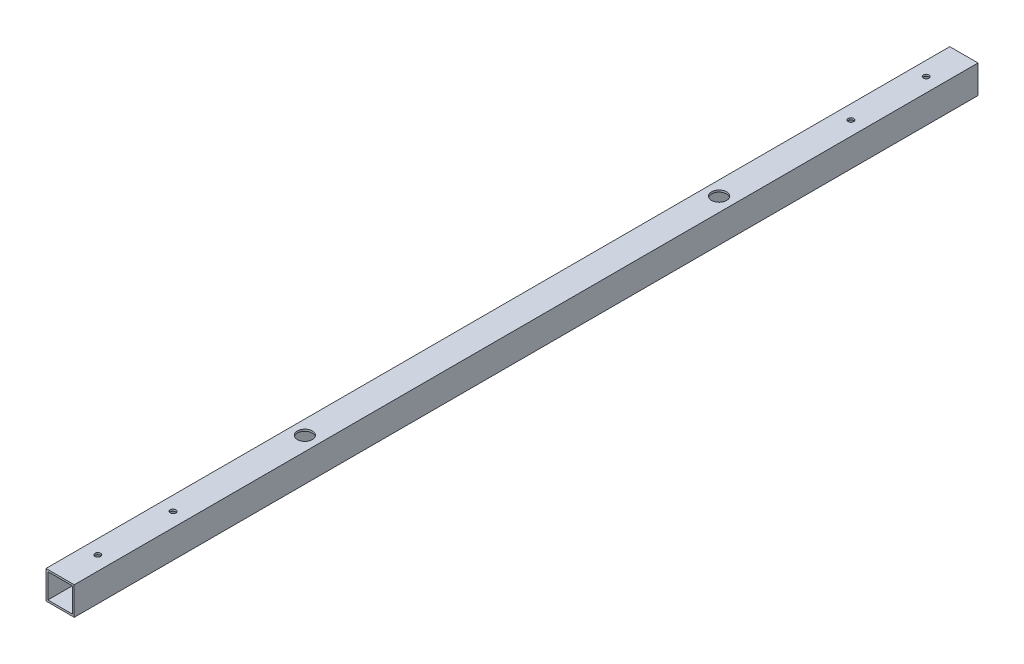
ISO-10303-21;
HEADER;
FILE_DESCRIPTION(('STEP AP214'),'2;1');
FILE_NAME('part.step','',(''),(''),'','','');
FILE_SCHEMA(('AUTOMOTIVE_DESIGN { 1 0 10303 214 1 1 1 1 }'));
ENDSEC;
DATA;
#1=APPLICATION_CONTEXT('core data for automotive mechanical design processes');
#2=APPLICATION_PROTOCOL_DEFINITION('international standard','automotive_design',2000,#1);
#3=PRODUCT_CONTEXT('',#1,'mechanical');
#4=PRODUCT('Part','Part','',(#3));
#5=PRODUCT_RELATED_PRODUCT_CATEGORY('part','',(#4));
#6=PRODUCT_DEFINITION_FORMATION('','',#4);
#7=PRODUCT_DEFINITION_CONTEXT('part definition',#1,'design');
#8=PRODUCT_DEFINITION('design','',#6,#7);
#9=PRODUCT_DEFINITION_SHAPE('','',#8);
#10=(LENGTH_UNIT() NAMED_UNIT(*) SI_UNIT(.MILLI.,.METRE.));
#11=(NAMED_UNIT(*) PLANE_ANGLE_UNIT() SI_UNIT($,.RADIAN.));
#12=(NAMED_UNIT(*) SI_UNIT($,.STERADIAN.) SOLID_ANGLE_UNIT());
#13=UNCERTAINTY_MEASURE_WITH_UNIT(LENGTH_MEASURE(1.E-05),#10,'distance_accuracy_value','');
#14=(GEOMETRIC_REPRESENTATION_CONTEXT(3) GLOBAL_UNCERTAINTY_ASSIGNED_CONTEXT((#13)) GLOBAL_UNIT_ASSIGNED_CONTEXT((#10,
#11,#12)) REPRESENTATION_CONTEXT('',''));
#15=CARTESIAN_POINT('',(0.,0.,0.));
#16=DIRECTION('',(0.,0.,1.));
#17=DIRECTION('',(1.,0.,0.));
#18=AXIS2_PLACEMENT_3D('',#15,#16,#17);
#19=CARTESIAN_POINT('',(7.5,-7.5,460.));
#20=DIRECTION('',(-1.,0.,0.));
#21=DIRECTION('',(0.,0.,1.));
#22=AXIS2_PLACEMENT_3D('',#19,#20,#21);
#23=PLANE('',#22);
#24=DIRECTION('',(0.,0.,-1.));
#25=VECTOR('',#24,1.);
#26=CARTESIAN_POINT('',(7.5,-7.5,460.));
#27=LINE('',#26,#25);
#28=CARTESIAN_POINT('',(7.5,-7.5,470.));
#29=VERTEX_POINT('',#28);
#30=CARTESIAN_POINT('',(7.5,-7.5,-10.));
#31=VERTEX_POINT('',#30);
#32=EDGE_CURVE('E104',#29,#31,#27,.T.);
#33=ORIENTED_EDGE('',*,*,#32,.T.);
#34=DIRECTION('',(0.,-1.,0.));
#35=VECTOR('',#34,1.);
#36=CARTESIAN_POINT('',(7.5,7.5,-10.));
#37=LINE('',#36,#35);
#38=CARTESIAN_POINT('',(7.5,7.5,-10.));
#39=VERTEX_POINT('',#38);
#40=EDGE_CURVE('E148',#39,#31,#37,.T.);
#41=ORIENTED_EDGE('',*,*,#40,.F.);
#42=DIRECTION('',(0.,0.,-1.));
#43=VECTOR('',#42,1.);
#44=CARTESIAN_POINT('',(7.5,7.5,460.));
#45=LINE('',#44,#43);
#46=CARTESIAN_POINT('',(7.5,7.5,470.));
#47=VERTEX_POINT('',#46);
#48=EDGE_CURVE('E11',#47,#39,#45,.T.);
#49=ORIENTED_EDGE('',*,*,#48,.F.);
#50=DIRECTION('',(0.,1.,0.));
#51=VECTOR('',#50,1.);
#52=CARTESIAN_POINT('',(7.5,-7.5,470.));
#53=LINE('',#52,#51);
#54=EDGE_CURVE('E136',#29,#47,#53,.T.);
#55=ORIENTED_EDGE('',*,*,#54,.F.);
#56=EDGE_LOOP('',(#33,#41,#49,#55));
#57=FACE_BOUND('',#56,.T.);
#58=ADVANCED_FACE('F34',(#57),#23,.F.);
#59=CARTESIAN_POINT('',(-7.5,7.5,460.));
#60=DIRECTION('',(0.,-1.,0.));
#61=DIRECTION('',(0.,0.,-1.));
#62=AXIS2_PLACEMENT_3D('',#59,#60,#61);
#63=PLANE('',#62);
#64=CARTESIAN_POINT('',(0.,7.5,50.));
#65=DIRECTION('',(0.,-1.,0.));
#66=DIRECTION('',(0.,0.,-1.));
#67=AXIS2_PLACEMENT_3D('',#64,#65,#66);
#68=CIRCLE('',#67,1.5);
#69=CARTESIAN_POINT('',(0.,7.5,48.5));
#70=VERTEX_POINT('',#69);
#71=EDGE_CURVE('E197',#70,#70,#68,.T.);
#72=ORIENTED_EDGE('',*,*,#71,.T.);
#73=EDGE_LOOP('',(#72));
#74=FACE_BOUND('',#73,.T.);
#75=CARTESIAN_POINT('',(0.,7.5,450.));
#76=DIRECTION('',(0.,-1.,0.));
#77=DIRECTION('',(0.,0.,1.));
#78=AXIS2_PLACEMENT_3D('',#75,#76,#77);
#79=CIRCLE('',#78,1.5);
#80=CARTESIAN_POINT('',(0.,7.5,451.5));
#81=VERTEX_POINT('',#80);
#82=EDGE_CURVE('E327',#81,#81,#79,.T.);
#83=ORIENTED_EDGE('',*,*,#82,.T.);
#84=EDGE_LOOP('',(#83));
#85=FACE_BOUND('',#84,.T.);
#86=CARTESIAN_POINT('',(0.,7.5,410.));
#87=DIRECTION('',(0.,-1.,0.));
#88=DIRECTION('',(0.,0.,1.));
#89=AXIS2_PLACEMENT_3D('',#86,#87,#88);
#90=CIRCLE('',#89,1.5);
#91=CARTESIAN_POINT('',(0.,7.5,411.5));
#92=VERTEX_POINT('',#91);
#93=EDGE_CURVE('E335',#92,#92,#90,.T.);
#94=ORIENTED_EDGE('',*,*,#93,.T.);
#95=EDGE_LOOP('',(#94));
#96=FACE_BOUND('',#95,.T.);
#97=CARTESIAN_POINT('',(0.,7.5,10.));
#98=DIRECTION('',(0.,-1.,0.));
#99=DIRECTION('',(0.,0.,-1.));
#100=AXIS2_PLACEMENT_3D('',#97,#98,#99);
#101=CIRCLE('',#100,1.5);
#102=CARTESIAN_POINT('',(0.,7.5,8.5));
#103=VERTEX_POINT('',#102);
#104=EDGE_CURVE('E193',#103,#103,#101,.T.);
#105=ORIENTED_EDGE('',*,*,#104,.T.);
#106=EDGE_LOOP('',(#105));
#107=FACE_BOUND('',#106,.T.);
#108=CARTESIAN_POINT('',(0.,7.5,340.));
#109=DIRECTION('',(0.,1.,0.));
#110=DIRECTION('',(0.,0.,1.));
#111=AXIS2_PLACEMENT_3D('',#108,#109,#110);
#112=CIRCLE('',#111,4.);
#113=CARTESIAN_POINT('',(0.,7.5,344.));
#114=VERTEX_POINT('',#113);
#115=EDGE_CURVE('E157',#114,#114,#112,.T.);
#116=ORIENTED_EDGE('',*,*,#115,.F.);
#117=EDGE_LOOP('',(#116));
#118=FACE_BOUND('',#117,.T.);
#119=CARTESIAN_POINT('',(0.,7.5,120.));
#120=DIRECTION('',(0.,1.,0.));
#121=DIRECTION('',(0.,0.,1.));
#122=AXIS2_PLACEMENT_3D('',#119,#120,#121);
#123=CIRCLE('',#122,4.);
#124=CARTESIAN_POINT('',(0.,7.5,124.));
#125=VERTEX_POINT('',#124);
#126=EDGE_CURVE('E161',#125,#125,#123,.T.);
#127=ORIENTED_EDGE('',*,*,#126,.F.);
#128=EDGE_LOOP('',(#127));
#129=FACE_BOUND('',#128,.T.);
#130=ORIENTED_EDGE('',*,*,#48,.T.);
#131=DIRECTION('',(1.,0.,0.));
#132=VECTOR('',#131,1.);
#133=CARTESIAN_POINT('',(-7.5,7.5,-10.));
#134=LINE('',#133,#132);
#135=CARTESIAN_POINT('',(-7.5,7.5,-10.));
#136=VERTEX_POINT('',#135);
#137=EDGE_CURVE('E145',#136,#39,#134,.T.);
#138=ORIENTED_EDGE('',*,*,#137,.F.);
#139=DIRECTION('',(0.,0.,-1.));
#140=VECTOR('',#139,1.);
#141=CARTESIAN_POINT('',(-7.5,7.5,460.));
#142=LINE('',#141,#140);
#143=CARTESIAN_POINT('',(-7.5,7.5,470.));
#144=VERTEX_POINT('',#143);
#145=EDGE_CURVE('E42',#144,#136,#142,.T.);
#146=ORIENTED_EDGE('',*,*,#145,.F.);
#147=DIRECTION('',(-1.,0.,0.));
#148=VECTOR('',#147,1.);
#149=CARTESIAN_POINT('',(7.5,7.5,470.));
#150=LINE('',#149,#148);
#151=EDGE_CURVE('E139',#47,#144,#150,.T.);
#152=ORIENTED_EDGE('',*,*,#151,.F.);
#153=EDGE_LOOP('',(#130,#138,#146,#152));
#154=FACE_BOUND('',#153,.T.);
#155=ADVANCED_FACE('F242',(#74,#85,#96,#107,#118,#129,#154),#63,.F.);
#156=CARTESIAN_POINT('',(-7.5,-7.5,460.));
#157=DIRECTION('',(1.,0.,0.));
#158=DIRECTION('',(0.,0.,-1.));
#159=AXIS2_PLACEMENT_3D('',#156,#157,#158);
#160=PLANE('',#159);
#161=ORIENTED_EDGE('',*,*,#145,.T.);
#162=DIRECTION('',(0.,1.,0.));
#163=VECTOR('',#162,1.);
#164=CARTESIAN_POINT('',(-7.5,-7.5,-10.));
#165=LINE('',#164,#163);
#166=CARTESIAN_POINT('',(-7.5,-7.5,-10.));
#167=VERTEX_POINT('',#166);
#168=EDGE_CURVE('E154',#167,#136,#165,.T.);
#169=ORIENTED_EDGE('',*,*,#168,.F.);
#170=DIRECTION('',(0.,0.,-1.));
#171=VECTOR('',#170,1.);
#172=CARTESIAN_POINT('',(-7.5,-7.5,460.));
#173=LINE('',#172,#171);
#174=CARTESIAN_POINT('',(-7.5,-7.5,470.));
#175=VERTEX_POINT('',#174);
#176=EDGE_CURVE('E183',#175,#167,#173,.T.);
#177=ORIENTED_EDGE('',*,*,#176,.F.);
#178=DIRECTION('',(0.,-1.,0.));
#179=VECTOR('',#178,1.);
#180=CARTESIAN_POINT('',(-7.5,7.5,470.));
#181=LINE('',#180,#179);
#182=EDGE_CURVE('E142',#144,#175,#181,.T.);
#183=ORIENTED_EDGE('',*,*,#182,.F.);
#184=EDGE_LOOP('',(#161,#169,#177,#183));
#185=FACE_BOUND('',#184,.T.);
#186=ADVANCED_FACE('F226',(#185),#160,.F.);
#187=CARTESIAN_POINT('',(-7.5,-7.5,460.));
#188=DIRECTION('',(0.,1.,0.));
#189=DIRECTION('',(0.,0.,1.));
#190=AXIS2_PLACEMENT_3D('',#187,#188,#189);
#191=PLANE('',#190);
#192=CARTESIAN_POINT('',(0.,-7.5,50.));
#193=DIRECTION('',(0.,-1.,0.));
#194=DIRECTION('',(0.,0.,-1.));
#195=AXIS2_PLACEMENT_3D('',#192,#193,#194);
#196=CIRCLE('',#195,1.5);
#197=CARTESIAN_POINT('',(0.,-7.5,48.5));
#198=VERTEX_POINT('',#197);
#199=EDGE_CURVE('E326',#198,#198,#196,.T.);
#200=ORIENTED_EDGE('',*,*,#199,.F.);
#201=EDGE_LOOP('',(#200));
#202=FACE_BOUND('',#201,.T.);
#203=CARTESIAN_POINT('',(0.,-7.5,450.));
#204=DIRECTION('',(0.,-1.,0.));
#205=DIRECTION('',(0.,0.,1.));
#206=AXIS2_PLACEMENT_3D('',#203,#204,#205);
#207=CIRCLE('',#206,1.5);
#208=CARTESIAN_POINT('',(0.,-7.5,451.5));
#209=VERTEX_POINT('',#208);
#210=EDGE_CURVE('E331',#209,#209,#207,.T.);
#211=ORIENTED_EDGE('',*,*,#210,.F.);
#212=EDGE_LOOP('',(#211));
#213=FACE_BOUND('',#212,.T.);
#214=CARTESIAN_POINT('',(0.,-7.5,410.));
#215=DIRECTION('',(0.,-1.,0.));
#216=DIRECTION('',(0.,0.,1.));
#217=AXIS2_PLACEMENT_3D('',#214,#215,#216);
#218=CIRCLE('',#217,1.5);
#219=CARTESIAN_POINT('',(0.,-7.5,411.5));
#220=VERTEX_POINT('',#219);
#221=EDGE_CURVE('E210',#220,#220,#218,.T.);
#222=ORIENTED_EDGE('',*,*,#221,.F.);
#223=EDGE_LOOP('',(#222));
#224=FACE_BOUND('',#223,.T.);
#225=CARTESIAN_POINT('',(0.,-7.5,10.));
#226=DIRECTION('',(0.,-1.,0.));
#227=DIRECTION('',(0.,0.,-1.));
#228=AXIS2_PLACEMENT_3D('',#225,#226,#227);
#229=CIRCLE('',#228,1.5);
#230=CARTESIAN_POINT('',(0.,-7.5,8.5));
#231=VERTEX_POINT('',#230);
#232=EDGE_CURVE('E216',#231,#231,#229,.T.);
#233=ORIENTED_EDGE('',*,*,#232,.F.);
#234=EDGE_LOOP('',(#233));
#235=FACE_BOUND('',#234,.T.);
#236=CARTESIAN_POINT('',(0.,-7.50000000000001,340.));
#237=DIRECTION('',(0.,1.,0.));
#238=DIRECTION('',(0.,0.,1.));
#239=AXIS2_PLACEMENT_3D('',#236,#237,#238);
#240=CIRCLE('',#239,1.5);
#241=CARTESIAN_POINT('',(0.,-7.50000000000001,341.5));
#242=VERTEX_POINT('',#241);
#243=EDGE_CURVE('E168',#242,#242,#240,.T.);
#244=ORIENTED_EDGE('',*,*,#243,.T.);
#245=EDGE_LOOP('',(#244));
#246=FACE_BOUND('',#245,.T.);
#247=CARTESIAN_POINT('',(0.,-7.50000000000001,120.));
#248=DIRECTION('',(0.,1.,0.));
#249=DIRECTION('',(0.,0.,1.));
#250=AXIS2_PLACEMENT_3D('',#247,#248,#249);
#251=CIRCLE('',#250,1.5);
#252=CARTESIAN_POINT('',(0.,-7.50000000000001,121.5));
#253=VERTEX_POINT('',#252);
#254=EDGE_CURVE('E174',#253,#253,#251,.T.);
#255=ORIENTED_EDGE('',*,*,#254,.T.);
#256=EDGE_LOOP('',(#255));
#257=FACE_BOUND('',#256,.T.);
#258=ORIENTED_EDGE('',*,*,#176,.T.);
#259=DIRECTION('',(-1.,0.,0.));
#260=VECTOR('',#259,1.);
#261=CARTESIAN_POINT('',(7.5,-7.5,-10.));
#262=LINE('',#261,#260);
#263=EDGE_CURVE('E151',#31,#167,#262,.T.);
#264=ORIENTED_EDGE('',*,*,#263,.F.);
#265=ORIENTED_EDGE('',*,*,#32,.F.);
#266=DIRECTION('',(1.,0.,0.));
#267=VECTOR('',#266,1.);
#268=CARTESIAN_POINT('',(-7.5,-7.5,470.));
#269=LINE('',#268,#267);
#270=EDGE_CURVE('E128',#175,#29,#269,.T.);
#271=ORIENTED_EDGE('',*,*,#270,.F.);
#272=EDGE_LOOP('',(#258,#264,#265,#271));
#273=FACE_BOUND('',#272,.T.);
#274=ADVANCED_FACE('F223',(#202,#213,#224,#235,#246,#257,#273),#191,.F.);
#275=CARTESIAN_POINT('',(-6.5,-6.5,460.));
#276=DIRECTION('',(1.,0.,0.));
#277=DIRECTION('',(0.,0.,-1.));
#278=AXIS2_PLACEMENT_3D('',#275,#276,#277);
#279=PLANE('',#278);
#280=DIRECTION('',(0.,0.,-1.));
#281=VECTOR('',#280,1.);
#282=CARTESIAN_POINT('',(-6.5,-6.5,460.));
#283=LINE('',#282,#281);
#284=CARTESIAN_POINT('',(-6.5,-6.5,470.));
#285=VERTEX_POINT('',#284);
#286=CARTESIAN_POINT('',(-6.5,-6.5,-10.));
#287=VERTEX_POINT('',#286);
#288=EDGE_CURVE('E55',#285,#287,#283,.T.);
#289=ORIENTED_EDGE('',*,*,#288,.T.);
#290=DIRECTION('',(0.,-1.,0.));
#291=VECTOR('',#290,1.);
#292=CARTESIAN_POINT('',(-6.5,-6.5,-10.));
#293=LINE('',#292,#291);
#294=CARTESIAN_POINT('',(-6.5,6.5,-10.));
#295=VERTEX_POINT('',#294);
#296=EDGE_CURVE('E99',#295,#287,#293,.T.);
#297=ORIENTED_EDGE('',*,*,#296,.F.);
#298=DIRECTION('',(0.,0.,-1.));
#299=VECTOR('',#298,1.);
#300=CARTESIAN_POINT('',(-6.5,6.5,460.));
#301=LINE('',#300,#299);
#302=CARTESIAN_POINT('',(-6.5,6.5,470.));
#303=VERTEX_POINT('',#302);
#304=EDGE_CURVE('E177',#303,#295,#301,.T.);
#305=ORIENTED_EDGE('',*,*,#304,.F.);
#306=DIRECTION('',(0.,-1.,0.));
#307=VECTOR('',#306,1.);
#308=CARTESIAN_POINT('',(-6.5,-6.5,470.));
#309=LINE('',#308,#307);
#310=EDGE_CURVE('E102',#303,#285,#309,.T.);
#311=ORIENTED_EDGE('',*,*,#310,.T.);
#312=EDGE_LOOP('',(#289,#297,#305,#311));
#313=FACE_BOUND('',#312,.T.);
#314=ADVANCED_FACE('F97',(#313),#279,.T.);
#315=CARTESIAN_POINT('',(-6.5,-6.5,460.));
#316=DIRECTION('',(0.,1.,0.));
#317=DIRECTION('',(0.,0.,1.));
#318=AXIS2_PLACEMENT_3D('',#315,#316,#317);
#319=PLANE('',#318);
#320=CARTESIAN_POINT('',(0.,-6.5,50.));
#321=DIRECTION('',(0.,1.,0.));
#322=DIRECTION('',(0.,0.,1.));
#323=AXIS2_PLACEMENT_3D('',#320,#321,#322);
#324=CIRCLE('',#323,1.5);
#325=CARTESIAN_POINT('',(0.,-6.5,51.5));
#326=VERTEX_POINT('',#325);
#327=EDGE_CURVE('E213',#326,#326,#324,.T.);
#328=ORIENTED_EDGE('',*,*,#327,.F.);
#329=EDGE_LOOP('',(#328));
#330=FACE_BOUND('',#329,.T.);
#331=CARTESIAN_POINT('',(0.,-6.5,450.));
#332=DIRECTION('',(0.,1.,0.));
#333=DIRECTION('',(0.,0.,1.));
#334=AXIS2_PLACEMENT_3D('',#331,#332,#333);
#335=CIRCLE('',#334,1.5);
#336=CARTESIAN_POINT('',(0.,-6.5,451.5));
#337=VERTEX_POINT('',#336);
#338=EDGE_CURVE('E200',#337,#337,#335,.T.);
#339=ORIENTED_EDGE('',*,*,#338,.F.);
#340=EDGE_LOOP('',(#339));
#341=FACE_BOUND('',#340,.T.);
#342=CARTESIAN_POINT('',(0.,-6.5,410.));
#343=DIRECTION('',(0.,1.,0.));
#344=DIRECTION('',(0.,0.,1.));
#345=AXIS2_PLACEMENT_3D('',#342,#343,#344);
#346=CIRCLE('',#345,1.5);
#347=CARTESIAN_POINT('',(0.,-6.5,411.5));
#348=VERTEX_POINT('',#347);
#349=EDGE_CURVE('E196',#348,#348,#346,.T.);
#350=ORIENTED_EDGE('',*,*,#349,.F.);
#351=EDGE_LOOP('',(#350));
#352=FACE_BOUND('',#351,.T.);
#353=CARTESIAN_POINT('',(0.,-6.5,10.));
#354=DIRECTION('',(0.,1.,0.));
#355=DIRECTION('',(0.,0.,1.));
#356=AXIS2_PLACEMENT_3D('',#353,#354,#355);
#357=CIRCLE('',#356,1.5);
#358=CARTESIAN_POINT('',(0.,-6.5,11.5));
#359=VERTEX_POINT('',#358);
#360=EDGE_CURVE('E123',#359,#359,#357,.T.);
#361=ORIENTED_EDGE('',*,*,#360,.F.);
#362=EDGE_LOOP('',(#361));
#363=FACE_BOUND('',#362,.T.);
#364=CARTESIAN_POINT('',(0.,-6.50000000000001,340.));
#365=DIRECTION('',(0.,1.,0.));
#366=DIRECTION('',(0.,0.,1.));
#367=AXIS2_PLACEMENT_3D('',#364,#365,#366);
#368=CIRCLE('',#367,1.5);
#369=CARTESIAN_POINT('',(0.,-6.50000000000001,341.5));
#370=VERTEX_POINT('',#369);
#371=EDGE_CURVE('E165',#370,#370,#368,.T.);
#372=ORIENTED_EDGE('',*,*,#371,.F.);
#373=EDGE_LOOP('',(#372));
#374=FACE_BOUND('',#373,.T.);
#375=CARTESIAN_POINT('',(0.,-6.50000000000001,120.));
#376=DIRECTION('',(0.,1.,0.));
#377=DIRECTION('',(0.,0.,1.));
#378=AXIS2_PLACEMENT_3D('',#375,#376,#377);
#379=CIRCLE('',#378,1.5);
#380=CARTESIAN_POINT('',(0.,-6.50000000000001,121.5));
#381=VERTEX_POINT('',#380);
#382=EDGE_CURVE('E171',#381,#381,#379,.T.);
#383=ORIENTED_EDGE('',*,*,#382,.F.);
#384=EDGE_LOOP('',(#383));
#385=FACE_BOUND('',#384,.T.);
#386=DIRECTION('',(0.,0.,-1.));
#387=VECTOR('',#386,1.);
#388=CARTESIAN_POINT('',(6.5,-6.5,460.));
#389=LINE('',#388,#387);
#390=CARTESIAN_POINT('',(6.5,-6.5,470.));
#391=VERTEX_POINT('',#390);
#392=CARTESIAN_POINT('',(6.5,-6.5,-10.));
#393=VERTEX_POINT('',#392);
#394=EDGE_CURVE('E50',#391,#393,#389,.T.);
#395=ORIENTED_EDGE('',*,*,#394,.T.);
#396=DIRECTION('',(1.,0.,0.));
#397=VECTOR('',#396,1.);
#398=CARTESIAN_POINT('',(6.5,-6.5,-10.));
#399=LINE('',#398,#397);
#400=EDGE_CURVE('E107',#287,#393,#399,.T.);
#401=ORIENTED_EDGE('',*,*,#400,.F.);
#402=ORIENTED_EDGE('',*,*,#288,.F.);
#403=DIRECTION('',(1.,0.,0.));
#404=VECTOR('',#403,1.);
#405=CARTESIAN_POINT('',(6.5,-6.5,470.));
#406=LINE('',#405,#404);
#407=EDGE_CURVE('E130',#285,#391,#406,.T.);
#408=ORIENTED_EDGE('',*,*,#407,.T.);
#409=EDGE_LOOP('',(#395,#401,#402,#408));
#410=FACE_BOUND('',#409,.T.);
#411=ADVANCED_FACE('F108',(#330,#341,#352,#363,#374,#385,#410),#319,.T.);
#412=CARTESIAN_POINT('',(6.5,-6.5,460.));
#413=DIRECTION('',(-1.,0.,0.));
#414=DIRECTION('',(0.,0.,1.));
#415=AXIS2_PLACEMENT_3D('',#412,#413,#414);
#416=PLANE('',#415);
#417=DIRECTION('',(0.,0.,-1.));
#418=VECTOR('',#417,1.);
#419=CARTESIAN_POINT('',(6.5,6.5,460.));
#420=LINE('',#419,#418);
#421=CARTESIAN_POINT('',(6.5,6.5,470.));
#422=VERTEX_POINT('',#421);
#423=CARTESIAN_POINT('',(6.5,6.5,-10.));
#424=VERTEX_POINT('',#423);
#425=EDGE_CURVE('E179',#422,#424,#420,.T.);
#426=ORIENTED_EDGE('',*,*,#425,.T.);
#427=DIRECTION('',(0.,1.,0.));
#428=VECTOR('',#427,1.);
#429=CARTESIAN_POINT('',(6.5,-6.5,-10.));
#430=LINE('',#429,#428);
#431=EDGE_CURVE('E111',#393,#424,#430,.T.);
#432=ORIENTED_EDGE('',*,*,#431,.F.);
#433=ORIENTED_EDGE('',*,*,#394,.F.);
#434=DIRECTION('',(0.,1.,0.));
#435=VECTOR('',#434,1.);
#436=CARTESIAN_POINT('',(6.5,-6.5,470.));
#437=LINE('',#436,#435);
#438=EDGE_CURVE('E120',#391,#422,#437,.T.);
#439=ORIENTED_EDGE('',*,*,#438,.T.);
#440=EDGE_LOOP('',(#426,#432,#433,#439));
#441=FACE_BOUND('',#440,.T.);
#442=ADVANCED_FACE('F265',(#441),#416,.T.);
#443=CARTESIAN_POINT('',(-6.5,6.5,460.));
#444=DIRECTION('',(0.,-1.,0.));
#445=DIRECTION('',(1.,0.,0.));
#446=AXIS2_PLACEMENT_3D('',#443,#444,#445);
#447=PLANE('',#446);
#448=CARTESIAN_POINT('',(0.,6.5,50.));
#449=DIRECTION('',(0.,-1.,0.));
#450=DIRECTION('',(1.,0.,0.));
#451=AXIS2_PLACEMENT_3D('',#448,#449,#450);
#452=CIRCLE('',#451,1.5);
#453=CARTESIAN_POINT('',(1.5,6.5,50.));
#454=VERTEX_POINT('',#453);
#455=EDGE_CURVE('E37',#454,#454,#452,.T.);
#456=ORIENTED_EDGE('',*,*,#455,.F.);
#457=EDGE_LOOP('',(#456));
#458=FACE_BOUND('',#457,.T.);
#459=CARTESIAN_POINT('',(0.,6.5,450.));
#460=DIRECTION('',(0.,-1.,0.));
#461=DIRECTION('',(1.,0.,0.));
#462=AXIS2_PLACEMENT_3D('',#459,#460,#461);
#463=CIRCLE('',#462,1.5);
#464=CARTESIAN_POINT('',(1.5,6.5,450.));
#465=VERTEX_POINT('',#464);
#466=EDGE_CURVE('E198',#465,#465,#463,.T.);
#467=ORIENTED_EDGE('',*,*,#466,.F.);
#468=EDGE_LOOP('',(#467));
#469=FACE_BOUND('',#468,.T.);
#470=CARTESIAN_POINT('',(0.,6.5,410.));
#471=DIRECTION('',(0.,-1.,0.));
#472=DIRECTION('',(1.,0.,0.));
#473=AXIS2_PLACEMENT_3D('',#470,#471,#472);
#474=CIRCLE('',#473,1.5);
#475=CARTESIAN_POINT('',(1.5,6.5,410.));
#476=VERTEX_POINT('',#475);
#477=EDGE_CURVE('E194',#476,#476,#474,.T.);
#478=ORIENTED_EDGE('',*,*,#477,.F.);
#479=EDGE_LOOP('',(#478));
#480=FACE_BOUND('',#479,.T.);
#481=CARTESIAN_POINT('',(0.,6.5,10.));
#482=DIRECTION('',(0.,-1.,0.));
#483=DIRECTION('',(1.,0.,0.));
#484=AXIS2_PLACEMENT_3D('',#481,#482,#483);
#485=CIRCLE('',#484,1.5);
#486=CARTESIAN_POINT('',(1.5,6.5,10.));
#487=VERTEX_POINT('',#486);
#488=EDGE_CURVE('E190',#487,#487,#485,.T.);
#489=ORIENTED_EDGE('',*,*,#488,.F.);
#490=EDGE_LOOP('',(#489));
#491=FACE_BOUND('',#490,.T.);
#492=CARTESIAN_POINT('',(0.,6.5,340.));
#493=DIRECTION('',(0.,-1.,0.));
#494=DIRECTION('',(1.,0.,0.));
#495=AXIS2_PLACEMENT_3D('',#492,#493,#494);
#496=CIRCLE('',#495,4.);
#497=CARTESIAN_POINT('',(4.,6.5,340.));
#498=VERTEX_POINT('',#497);
#499=EDGE_CURVE('E160',#498,#498,#496,.T.);
#500=ORIENTED_EDGE('',*,*,#499,.F.);
#501=EDGE_LOOP('',(#500));
#502=FACE_BOUND('',#501,.T.);
#503=CARTESIAN_POINT('',(0.,6.5,120.));
#504=DIRECTION('',(0.,-1.,0.));
#505=DIRECTION('',(1.,0.,0.));
#506=AXIS2_PLACEMENT_3D('',#503,#504,#505);
#507=CIRCLE('',#506,4.);
#508=CARTESIAN_POINT('',(4.,6.5,120.));
#509=VERTEX_POINT('',#508);
#510=EDGE_CURVE('E164',#509,#509,#507,.T.);
#511=ORIENTED_EDGE('',*,*,#510,.F.);
#512=EDGE_LOOP('',(#511));
#513=FACE_BOUND('',#512,.T.);
#514=ORIENTED_EDGE('',*,*,#304,.T.);
#515=DIRECTION('',(-1.,0.,0.));
#516=VECTOR('',#515,1.);
#517=CARTESIAN_POINT('',(6.5,6.5,-10.));
#518=LINE('',#517,#516);
#519=EDGE_CURVE('E116',#424,#295,#518,.T.);
#520=ORIENTED_EDGE('',*,*,#519,.F.);
#521=ORIENTED_EDGE('',*,*,#425,.F.);
#522=DIRECTION('',(-1.,0.,0.));
#523=VECTOR('',#522,1.);
#524=CARTESIAN_POINT('',(6.5,6.5,470.));
#525=LINE('',#524,#523);
#526=EDGE_CURVE('E117',#422,#303,#525,.T.);
#527=ORIENTED_EDGE('',*,*,#526,.T.);
#528=EDGE_LOOP('',(#514,#520,#521,#527));
#529=FACE_BOUND('',#528,.T.);
#530=ADVANCED_FACE('F269',(#458,#469,#480,#491,#502,#513,#529),#447,.T.);
#531=CARTESIAN_POINT('',(0.,-472.5,120.));
#532=DIRECTION('',(0.,1.,0.));
#533=DIRECTION('',(0.,0.,1.));
#534=AXIS2_PLACEMENT_3D('',#531,#532,#533);
#535=CYLINDRICAL_SURFACE('',#534,1.5);
#536=ORIENTED_EDGE('',*,*,#382,.T.);
#537=EDGE_LOOP('',(#536));
#538=FACE_BOUND('',#537,.T.);
#539=ORIENTED_EDGE('',*,*,#254,.F.);
#540=EDGE_LOOP('',(#539));
#541=FACE_BOUND('',#540,.T.);
#542=ADVANCED_FACE('F273',(#538,#541),#535,.F.);
#543=CARTESIAN_POINT('',(0.,-472.5,340.));
#544=DIRECTION('',(0.,1.,0.));
#545=DIRECTION('',(0.,0.,1.));
#546=AXIS2_PLACEMENT_3D('',#543,#544,#545);
#547=CYLINDRICAL_SURFACE('',#546,1.5);
#548=ORIENTED_EDGE('',*,*,#371,.T.);
#549=EDGE_LOOP('',(#548));
#550=FACE_BOUND('',#549,.T.);
#551=ORIENTED_EDGE('',*,*,#243,.F.);
#552=EDGE_LOOP('',(#551));
#553=FACE_BOUND('',#552,.T.);
#554=ADVANCED_FACE('F277',(#550,#553),#547,.F.);
#555=CARTESIAN_POINT('',(0.,5.5,120.));
#556=DIRECTION('',(0.,1.,0.));
#557=DIRECTION('',(0.,0.,1.));
#558=AXIS2_PLACEMENT_3D('',#555,#556,#557);
#559=CYLINDRICAL_SURFACE('',#558,4.);
#560=ORIENTED_EDGE('',*,*,#510,.T.);
#561=EDGE_LOOP('',(#560));
#562=FACE_BOUND('',#561,.T.);
#563=ORIENTED_EDGE('',*,*,#126,.T.);
#564=EDGE_LOOP('',(#563));
#565=FACE_BOUND('',#564,.T.);
#566=ADVANCED_FACE('F281',(#562,#565),#559,.F.);
#567=CARTESIAN_POINT('',(0.,5.5,340.));
#568=DIRECTION('',(0.,1.,0.));
#569=DIRECTION('',(0.,0.,1.));
#570=AXIS2_PLACEMENT_3D('',#567,#568,#569);
#571=CYLINDRICAL_SURFACE('',#570,4.);
#572=ORIENTED_EDGE('',*,*,#499,.T.);
#573=EDGE_LOOP('',(#572));
#574=FACE_BOUND('',#573,.T.);
#575=ORIENTED_EDGE('',*,*,#115,.T.);
#576=EDGE_LOOP('',(#575));
#577=FACE_BOUND('',#576,.T.);
#578=ADVANCED_FACE('F285',(#574,#577),#571,.F.);
#579=CARTESIAN_POINT('',(0.,0.,-10.));
#580=DIRECTION('',(0.,0.,-1.));
#581=DIRECTION('',(-1.,0.,0.));
#582=AXIS2_PLACEMENT_3D('',#579,#580,#581);
#583=PLANE('',#582);
#584=ORIENTED_EDGE('',*,*,#296,.T.);
#585=ORIENTED_EDGE('',*,*,#400,.T.);
#586=ORIENTED_EDGE('',*,*,#431,.T.);
#587=ORIENTED_EDGE('',*,*,#519,.T.);
#588=EDGE_LOOP('',(#584,#585,#586,#587));
#589=FACE_BOUND('',#588,.T.);
#590=ORIENTED_EDGE('',*,*,#137,.T.);
#591=ORIENTED_EDGE('',*,*,#40,.T.);
#592=ORIENTED_EDGE('',*,*,#263,.T.);
#593=ORIENTED_EDGE('',*,*,#168,.T.);
#594=EDGE_LOOP('',(#590,#591,#592,#593));
#595=FACE_BOUND('',#594,.T.);
#596=ADVANCED_FACE('F113',(#589,#595),#583,.T.);
#597=CARTESIAN_POINT('',(0.,0.,470.));
#598=DIRECTION('',(0.,0.,1.));
#599=DIRECTION('',(1.,0.,0.));
#600=AXIS2_PLACEMENT_3D('',#597,#598,#599);
#601=PLANE('',#600);
#602=ORIENTED_EDGE('',*,*,#310,.F.);
#603=ORIENTED_EDGE('',*,*,#526,.F.);
#604=ORIENTED_EDGE('',*,*,#438,.F.);
#605=ORIENTED_EDGE('',*,*,#407,.F.);
#606=EDGE_LOOP('',(#602,#603,#604,#605));
#607=FACE_BOUND('',#606,.T.);
#608=ORIENTED_EDGE('',*,*,#270,.T.);
#609=ORIENTED_EDGE('',*,*,#54,.T.);
#610=ORIENTED_EDGE('',*,*,#151,.T.);
#611=ORIENTED_EDGE('',*,*,#182,.T.);
#612=EDGE_LOOP('',(#608,#609,#610,#611));
#613=FACE_BOUND('',#612,.T.);
#614=ADVANCED_FACE('F244',(#607,#613),#601,.T.);
#615=CARTESIAN_POINT('',(0.,7.5,10.));
#616=DIRECTION('',(0.,-1.,0.));
#617=DIRECTION('',(0.,0.,-1.));
#618=AXIS2_PLACEMENT_3D('',#615,#616,#617);
#619=CYLINDRICAL_SURFACE('',#618,1.5);
#620=ORIENTED_EDGE('',*,*,#488,.T.);
#621=EDGE_LOOP('',(#620));
#622=FACE_BOUND('',#621,.T.);
#623=ORIENTED_EDGE('',*,*,#104,.F.);
#624=EDGE_LOOP('',(#623));
#625=FACE_BOUND('',#624,.T.);
#626=ADVANCED_FACE('F293',(#622,#625),#619,.F.);
#627=ORIENTED_EDGE('',*,*,#360,.T.);
#628=EDGE_LOOP('',(#627));
#629=FACE_BOUND('',#628,.T.);
#630=ORIENTED_EDGE('',*,*,#232,.T.);
#631=EDGE_LOOP('',(#630));
#632=FACE_BOUND('',#631,.T.);
#633=ADVANCED_FACE('F221',(#629,#632),#619,.F.);
#634=CARTESIAN_POINT('',(0.,7.5,410.));
#635=DIRECTION('',(0.,-1.,0.));
#636=DIRECTION('',(0.,0.,-1.));
#637=AXIS2_PLACEMENT_3D('',#634,#635,#636);
#638=CYLINDRICAL_SURFACE('',#637,1.5);
#639=ORIENTED_EDGE('',*,*,#477,.T.);
#640=EDGE_LOOP('',(#639));
#641=FACE_BOUND('',#640,.T.);
#642=ORIENTED_EDGE('',*,*,#93,.F.);
#643=EDGE_LOOP('',(#642));
#644=FACE_BOUND('',#643,.T.);
#645=ADVANCED_FACE('F298',(#641,#644),#638,.F.);
#646=CARTESIAN_POINT('',(0.,7.5,450.));
#647=DIRECTION('',(0.,-1.,0.));
#648=DIRECTION('',(0.,0.,-1.));
#649=AXIS2_PLACEMENT_3D('',#646,#647,#648);
#650=CYLINDRICAL_SURFACE('',#649,1.5);
#651=ORIENTED_EDGE('',*,*,#466,.T.);
#652=EDGE_LOOP('',(#651));
#653=FACE_BOUND('',#652,.T.);
#654=ORIENTED_EDGE('',*,*,#82,.F.);
#655=EDGE_LOOP('',(#654));
#656=FACE_BOUND('',#655,.T.);
#657=ADVANCED_FACE('F301',(#653,#656),#650,.F.);
#658=CARTESIAN_POINT('',(0.,7.5,50.));
#659=DIRECTION('',(0.,-1.,0.));
#660=DIRECTION('',(0.,0.,-1.));
#661=AXIS2_PLACEMENT_3D('',#658,#659,#660);
#662=CYLINDRICAL_SURFACE('',#661,1.5);
#663=ORIENTED_EDGE('',*,*,#455,.T.);
#664=EDGE_LOOP('',(#663));
#665=FACE_BOUND('',#664,.T.);
#666=ORIENTED_EDGE('',*,*,#71,.F.);
#667=EDGE_LOOP('',(#666));
#668=FACE_BOUND('',#667,.T.);
#669=ADVANCED_FACE('F306',(#665,#668),#662,.F.);
#670=ORIENTED_EDGE('',*,*,#349,.T.);
#671=EDGE_LOOP('',(#670));
#672=FACE_BOUND('',#671,.T.);
#673=ORIENTED_EDGE('',*,*,#221,.T.);
#674=EDGE_LOOP('',(#673));
#675=FACE_BOUND('',#674,.T.);
#676=ADVANCED_FACE('F303',(#672,#675),#638,.F.);
#677=ORIENTED_EDGE('',*,*,#338,.T.);
#678=EDGE_LOOP('',(#677));
#679=FACE_BOUND('',#678,.T.);
#680=ORIENTED_EDGE('',*,*,#210,.T.);
#681=EDGE_LOOP('',(#680));
#682=FACE_BOUND('',#681,.T.);
#683=ADVANCED_FACE('F307',(#679,#682),#650,.F.);
#684=ORIENTED_EDGE('',*,*,#327,.T.);
#685=EDGE_LOOP('',(#684));
#686=FACE_BOUND('',#685,.T.);
#687=ORIENTED_EDGE('',*,*,#199,.T.);
#688=EDGE_LOOP('',(#687));
#689=FACE_BOUND('',#688,.T.);
#690=ADVANCED_FACE('F310',(#686,#689),#662,.F.);
#691=CLOSED_SHELL('',(#58,#155,#186,#274,#314,#411,#442,#530,#542,#554,#566,#578,#596,#614,#626,
#633,#645,#657,#669,#676,#683,#690));
#692=MANIFOLD_SOLID_BREP('B2',#691);
#693=ADVANCED_BREP_SHAPE_REPRESENTATION('',(#18,#692),#14);
#694=SHAPE_DEFINITION_REPRESENTATION(#9,#693);
ENDSEC;
END-ISO-10303-21;
